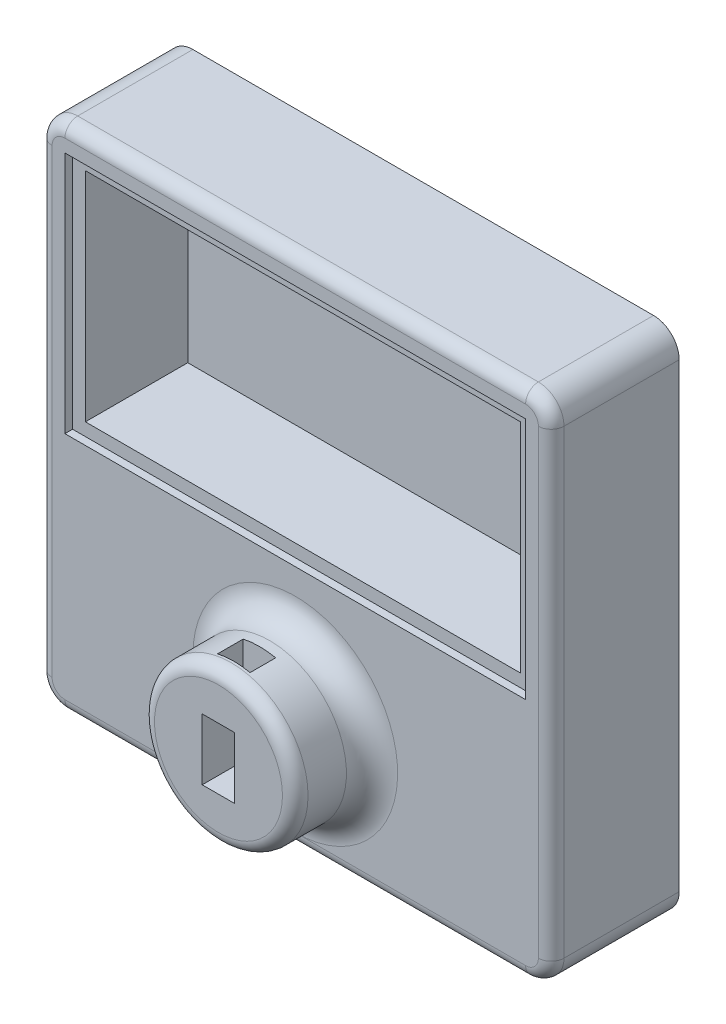
ISO-10303-21;
HEADER;
FILE_DESCRIPTION(('STEP AP214'),'2;1');
FILE_NAME('part.step','',(''),(''),'','','');
FILE_SCHEMA(('AUTOMOTIVE_DESIGN { 1 0 10303 214 1 1 1 1 }'));
ENDSEC;
DATA;
#1=APPLICATION_CONTEXT('core data for automotive mechanical design processes');
#2=APPLICATION_PROTOCOL_DEFINITION('international standard','automotive_design',2000,#1);
#3=PRODUCT_CONTEXT('',#1,'mechanical');
#4=PRODUCT('Part','Part','',(#3));
#5=PRODUCT_RELATED_PRODUCT_CATEGORY('part','',(#4));
#6=PRODUCT_DEFINITION_FORMATION('','',#4);
#7=PRODUCT_DEFINITION_CONTEXT('part definition',#1,'design');
#8=PRODUCT_DEFINITION('design','',#6,#7);
#9=PRODUCT_DEFINITION_SHAPE('','',#8);
#10=(LENGTH_UNIT() NAMED_UNIT(*) SI_UNIT(.MILLI.,.METRE.));
#11=(NAMED_UNIT(*) PLANE_ANGLE_UNIT() SI_UNIT($,.RADIAN.));
#12=(NAMED_UNIT(*) SI_UNIT($,.STERADIAN.) SOLID_ANGLE_UNIT());
#13=UNCERTAINTY_MEASURE_WITH_UNIT(LENGTH_MEASURE(1.E-05),#10,'distance_accuracy_value','');
#14=(GEOMETRIC_REPRESENTATION_CONTEXT(3) GLOBAL_UNCERTAINTY_ASSIGNED_CONTEXT((#13)) GLOBAL_UNIT_ASSIGNED_CONTEXT((#10,
#11,#12)) REPRESENTATION_CONTEXT('',''));
#15=CARTESIAN_POINT('',(0.,0.,0.));
#16=DIRECTION('',(0.,0.,1.));
#17=DIRECTION('',(1.,0.,0.));
#18=AXIS2_PLACEMENT_3D('',#15,#16,#17);
#19=CARTESIAN_POINT('',(0.,0.,50.));
#20=DIRECTION('',(1.,0.,0.));
#21=DIRECTION('',(0.,0.,-1.));
#22=AXIS2_PLACEMENT_3D('',#19,#20,#21);
#23=PLANE('',#22);
#24=DIRECTION('',(0.,0.,-1.));
#25=VECTOR('',#24,1.);
#26=CARTESIAN_POINT('',(0.,10.,50.));
#27=LINE('',#26,#25);
#28=CARTESIAN_POINT('',(0.,10.,0.));
#29=VERTEX_POINT('',#28);
#30=CARTESIAN_POINT('',(0.,10.,45.));
#31=VERTEX_POINT('',#30);
#32=EDGE_CURVE('E346',#29,#31,#27,.F.);
#33=ORIENTED_EDGE('',*,*,#32,.T.);
#34=DIRECTION('',(0.,-1.,0.));
#35=VECTOR('',#34,1.);
#36=CARTESIAN_POINT('',(0.,0.,45.));
#37=LINE('',#36,#35);
#38=CARTESIAN_POINT('',(0.,190.,45.));
#39=VERTEX_POINT('',#38);
#40=EDGE_CURVE('E385',#31,#39,#37,.F.);
#41=ORIENTED_EDGE('',*,*,#40,.T.);
#42=DIRECTION('',(0.,0.,-1.));
#43=VECTOR('',#42,1.);
#44=CARTESIAN_POINT('',(0.,190.,50.));
#45=LINE('',#44,#43);
#46=CARTESIAN_POINT('',(0.,190.,0.));
#47=VERTEX_POINT('',#46);
#48=EDGE_CURVE('E349',#39,#47,#45,.T.);
#49=ORIENTED_EDGE('',*,*,#48,.T.);
#50=DIRECTION('',(0.,-1.,0.));
#51=VECTOR('',#50,1.);
#52=CARTESIAN_POINT('',(0.,0.,0.));
#53=LINE('',#52,#51);
#54=EDGE_CURVE('E305',#47,#29,#53,.T.);
#55=ORIENTED_EDGE('',*,*,#54,.T.);
#56=EDGE_LOOP('',(#33,#41,#49,#55));
#57=FACE_BOUND('',#56,.T.);
#58=ADVANCED_FACE('F36',(#57),#23,.F.);
#59=CARTESIAN_POINT('',(0.,0.,50.));
#60=DIRECTION('',(0.,1.,0.));
#61=DIRECTION('',(0.,0.,1.));
#62=AXIS2_PLACEMENT_3D('',#59,#60,#61);
#63=PLANE('',#62);
#64=DIRECTION('',(0.,0.,-1.));
#65=VECTOR('',#64,1.);
#66=CARTESIAN_POINT('',(190.,0.,50.));
#67=LINE('',#66,#65);
#68=CARTESIAN_POINT('',(190.,0.,0.));
#69=VERTEX_POINT('',#68);
#70=CARTESIAN_POINT('',(190.,0.,45.));
#71=VERTEX_POINT('',#70);
#72=EDGE_CURVE('E338',#69,#71,#67,.F.);
#73=ORIENTED_EDGE('',*,*,#72,.T.);
#74=DIRECTION('',(1.,0.,0.));
#75=VECTOR('',#74,1.);
#76=CARTESIAN_POINT('',(0.,0.,45.));
#77=LINE('',#76,#75);
#78=CARTESIAN_POINT('',(10.,0.,45.));
#79=VERTEX_POINT('',#78);
#80=EDGE_CURVE('E11',#71,#79,#77,.F.);
#81=ORIENTED_EDGE('',*,*,#80,.T.);
#82=DIRECTION('',(0.,0.,-1.));
#83=VECTOR('',#82,1.);
#84=CARTESIAN_POINT('',(10.,0.,50.));
#85=LINE('',#84,#83);
#86=CARTESIAN_POINT('',(10.,0.,0.));
#87=VERTEX_POINT('',#86);
#88=EDGE_CURVE('E336',#79,#87,#85,.T.);
#89=ORIENTED_EDGE('',*,*,#88,.T.);
#90=DIRECTION('',(1.,0.,0.));
#91=VECTOR('',#90,1.);
#92=CARTESIAN_POINT('',(0.,0.,0.));
#93=LINE('',#92,#91);
#94=EDGE_CURVE('E314',#87,#69,#93,.T.);
#95=ORIENTED_EDGE('',*,*,#94,.T.);
#96=EDGE_LOOP('',(#73,#81,#89,#95));
#97=FACE_BOUND('',#96,.T.);
#98=ADVANCED_FACE('F474',(#97),#63,.F.);
#99=CARTESIAN_POINT('',(200.,0.,50.));
#100=DIRECTION('',(-1.,0.,0.));
#101=DIRECTION('',(0.,0.,1.));
#102=AXIS2_PLACEMENT_3D('',#99,#100,#101);
#103=PLANE('',#102);
#104=DIRECTION('',(0.,0.,-1.));
#105=VECTOR('',#104,1.);
#106=CARTESIAN_POINT('',(200.,190.,50.));
#107=LINE('',#106,#105);
#108=CARTESIAN_POINT('',(200.,190.,0.));
#109=VERTEX_POINT('',#108);
#110=CARTESIAN_POINT('',(200.,190.,45.));
#111=VERTEX_POINT('',#110);
#112=EDGE_CURVE('E323',#109,#111,#107,.F.);
#113=ORIENTED_EDGE('',*,*,#112,.T.);
#114=DIRECTION('',(0.,1.,0.));
#115=VECTOR('',#114,1.);
#116=CARTESIAN_POINT('',(200.,0.,45.));
#117=LINE('',#116,#115);
#118=CARTESIAN_POINT('',(200.,10.,45.));
#119=VERTEX_POINT('',#118);
#120=EDGE_CURVE('E393',#111,#119,#117,.F.);
#121=ORIENTED_EDGE('',*,*,#120,.T.);
#122=DIRECTION('',(0.,0.,-1.));
#123=VECTOR('',#122,1.);
#124=CARTESIAN_POINT('',(200.,10.,50.));
#125=LINE('',#124,#123);
#126=CARTESIAN_POINT('',(200.,10.,0.));
#127=VERTEX_POINT('',#126);
#128=EDGE_CURVE('E326',#119,#127,#125,.T.);
#129=ORIENTED_EDGE('',*,*,#128,.T.);
#130=DIRECTION('',(0.,1.,0.));
#131=VECTOR('',#130,1.);
#132=CARTESIAN_POINT('',(200.,0.,0.));
#133=LINE('',#132,#131);
#134=EDGE_CURVE('E317',#127,#109,#133,.T.);
#135=ORIENTED_EDGE('',*,*,#134,.T.);
#136=EDGE_LOOP('',(#113,#121,#129,#135));
#137=FACE_BOUND('',#136,.T.);
#138=ADVANCED_FACE('F433',(#137),#103,.F.);
#139=CARTESIAN_POINT('',(0.,200.,50.));
#140=DIRECTION('',(0.,-1.,0.));
#141=DIRECTION('',(0.,0.,-1.));
#142=AXIS2_PLACEMENT_3D('',#139,#140,#141);
#143=PLANE('',#142);
#144=DIRECTION('',(0.,0.,-1.));
#145=VECTOR('',#144,1.);
#146=CARTESIAN_POINT('',(10.,200.,50.));
#147=LINE('',#146,#145);
#148=CARTESIAN_POINT('',(10.,200.,0.));
#149=VERTEX_POINT('',#148);
#150=CARTESIAN_POINT('',(10.,200.,45.));
#151=VERTEX_POINT('',#150);
#152=EDGE_CURVE('E341',#149,#151,#147,.F.);
#153=ORIENTED_EDGE('',*,*,#152,.T.);
#154=DIRECTION('',(-1.,0.,0.));
#155=VECTOR('',#154,1.);
#156=CARTESIAN_POINT('',(0.,200.,45.));
#157=LINE('',#156,#155);
#158=CARTESIAN_POINT('',(190.,200.,45.));
#159=VERTEX_POINT('',#158);
#160=EDGE_CURVE('E389',#151,#159,#157,.F.);
#161=ORIENTED_EDGE('',*,*,#160,.T.);
#162=DIRECTION('',(0.,0.,-1.));
#163=VECTOR('',#162,1.);
#164=CARTESIAN_POINT('',(190.,200.,50.));
#165=LINE('',#164,#163);
#166=CARTESIAN_POINT('',(190.,200.,0.));
#167=VERTEX_POINT('',#166);
#168=EDGE_CURVE('E344',#159,#167,#165,.T.);
#169=ORIENTED_EDGE('',*,*,#168,.T.);
#170=DIRECTION('',(-1.,0.,0.));
#171=VECTOR('',#170,1.);
#172=CARTESIAN_POINT('',(0.,200.,0.));
#173=LINE('',#172,#171);
#174=EDGE_CURVE('E320',#167,#149,#173,.T.);
#175=ORIENTED_EDGE('',*,*,#174,.T.);
#176=EDGE_LOOP('',(#153,#161,#169,#175));
#177=FACE_BOUND('',#176,.T.);
#178=ADVANCED_FACE('F445',(#177),#143,.F.);
#179=CARTESIAN_POINT('',(0.,0.,50.));
#180=DIRECTION('',(0.,0.,-1.));
#181=DIRECTION('',(-1.,0.,0.));
#182=AXIS2_PLACEMENT_3D('',#179,#180,#181);
#183=PLANE('',#182);
#184=DIRECTION('',(1.,0.,0.));
#185=VECTOR('',#184,1.);
#186=CARTESIAN_POINT('',(10.,95.,50.));
#187=LINE('',#186,#185);
#188=CARTESIAN_POINT('',(10.,95.,50.));
#189=VERTEX_POINT('',#188);
#190=CARTESIAN_POINT('',(190.,95.,50.));
#191=VERTEX_POINT('',#190);
#192=EDGE_CURVE('E295',#189,#191,#187,.T.);
#193=ORIENTED_EDGE('',*,*,#192,.F.);
#194=DIRECTION('',(0.,-1.,0.));
#195=VECTOR('',#194,1.);
#196=CARTESIAN_POINT('',(10.,190.,50.));
#197=LINE('',#196,#195);
#198=CARTESIAN_POINT('',(10.,190.,50.));
#199=VERTEX_POINT('',#198);
#200=EDGE_CURVE('E273',#199,#189,#197,.T.);
#201=ORIENTED_EDGE('',*,*,#200,.F.);
#202=DIRECTION('',(-1.,0.,0.));
#203=VECTOR('',#202,1.);
#204=CARTESIAN_POINT('',(10.,190.,50.));
#205=LINE('',#204,#203);
#206=CARTESIAN_POINT('',(190.,190.,50.));
#207=VERTEX_POINT('',#206);
#208=EDGE_CURVE('E284',#207,#199,#205,.T.);
#209=ORIENTED_EDGE('',*,*,#208,.F.);
#210=DIRECTION('',(0.,1.,0.));
#211=VECTOR('',#210,1.);
#212=CARTESIAN_POINT('',(190.,190.,50.));
#213=LINE('',#212,#211);
#214=EDGE_CURVE('E298',#191,#207,#213,.T.);
#215=ORIENTED_EDGE('',*,*,#214,.F.);
#216=EDGE_LOOP('',(#193,#201,#209,#215));
#217=FACE_BOUND('',#216,.T.);
#218=DIRECTION('',(0.,-1.,0.));
#219=VECTOR('',#218,1.);
#220=CARTESIAN_POINT('',(5.,0.,50.));
#221=LINE('',#220,#219);
#222=CARTESIAN_POINT('',(5.,190.,50.));
#223=VERTEX_POINT('',#222);
#224=CARTESIAN_POINT('',(5.,10.,50.));
#225=VERTEX_POINT('',#224);
#226=EDGE_CURVE('E377',#223,#225,#221,.T.);
#227=ORIENTED_EDGE('',*,*,#226,.T.);
#228=CARTESIAN_POINT('',(10.,10.,50.));
#229=DIRECTION('',(0.,0.,-1.));
#230=DIRECTION('',(-1.,0.,0.));
#231=AXIS2_PLACEMENT_3D('',#228,#229,#230);
#232=CIRCLE('',#231,5.);
#233=CARTESIAN_POINT('',(10.,5.,50.));
#234=VERTEX_POINT('',#233);
#235=EDGE_CURVE('E379',#225,#234,#232,.F.);
#236=ORIENTED_EDGE('',*,*,#235,.T.);
#237=DIRECTION('',(1.,0.,0.));
#238=VECTOR('',#237,1.);
#239=CARTESIAN_POINT('',(0.,5.,50.));
#240=LINE('',#239,#238);
#241=CARTESIAN_POINT('',(100.,5.,50.));
#242=VERTEX_POINT('',#241);
#243=EDGE_CURVE('E365',#234,#242,#240,.T.);
#244=ORIENTED_EDGE('',*,*,#243,.T.);
#245=CARTESIAN_POINT('',(100.,45.,50.));
#246=DIRECTION('',(0.,0.,-1.));
#247=DIRECTION('',(-1.,0.,0.));
#248=AXIS2_PLACEMENT_3D('',#245,#246,#247);
#249=CIRCLE('',#248,40.);
#250=EDGE_CURVE('E354',#242,#242,#249,.T.);
#251=ORIENTED_EDGE('',*,*,#250,.T.);
#252=DIRECTION('',(1.,0.,0.));
#253=VECTOR('',#252,1.);
#254=CARTESIAN_POINT('',(0.,5.,50.));
#255=LINE('',#254,#253);
#256=CARTESIAN_POINT('',(190.,5.,50.));
#257=VERTEX_POINT('',#256);
#258=EDGE_CURVE('E363',#242,#257,#255,.T.);
#259=ORIENTED_EDGE('',*,*,#258,.T.);
#260=CARTESIAN_POINT('',(190.,10.,50.));
#261=DIRECTION('',(0.,0.,-1.));
#262=DIRECTION('',(-1.,0.,0.));
#263=AXIS2_PLACEMENT_3D('',#260,#261,#262);
#264=CIRCLE('',#263,5.);
#265=CARTESIAN_POINT('',(195.,10.,50.));
#266=VERTEX_POINT('',#265);
#267=EDGE_CURVE('E367',#257,#266,#264,.F.);
#268=ORIENTED_EDGE('',*,*,#267,.T.);
#269=DIRECTION('',(0.,1.,0.));
#270=VECTOR('',#269,1.);
#271=CARTESIAN_POINT('',(195.,0.,50.));
#272=LINE('',#271,#270);
#273=CARTESIAN_POINT('',(195.,190.,50.));
#274=VERTEX_POINT('',#273);
#275=EDGE_CURVE('E369',#266,#274,#272,.T.);
#276=ORIENTED_EDGE('',*,*,#275,.T.);
#277=CARTESIAN_POINT('',(190.,190.,50.));
#278=DIRECTION('',(0.,0.,-1.));
#279=DIRECTION('',(-1.,0.,0.));
#280=AXIS2_PLACEMENT_3D('',#277,#278,#279);
#281=CIRCLE('',#280,5.);
#282=CARTESIAN_POINT('',(190.,195.,50.));
#283=VERTEX_POINT('',#282);
#284=EDGE_CURVE('E371',#274,#283,#281,.F.);
#285=ORIENTED_EDGE('',*,*,#284,.T.);
#286=DIRECTION('',(-1.,0.,0.));
#287=VECTOR('',#286,1.);
#288=CARTESIAN_POINT('',(0.,195.,50.));
#289=LINE('',#288,#287);
#290=CARTESIAN_POINT('',(10.,195.,50.));
#291=VERTEX_POINT('',#290);
#292=EDGE_CURVE('E373',#283,#291,#289,.T.);
#293=ORIENTED_EDGE('',*,*,#292,.T.);
#294=CARTESIAN_POINT('',(10.,190.,50.));
#295=DIRECTION('',(0.,0.,-1.));
#296=DIRECTION('',(-1.,0.,0.));
#297=AXIS2_PLACEMENT_3D('',#294,#295,#296);
#298=CIRCLE('',#297,5.);
#299=EDGE_CURVE('E375',#291,#223,#298,.F.);
#300=ORIENTED_EDGE('',*,*,#299,.T.);
#301=EDGE_LOOP('',(#227,#236,#244,#251,#259,#268,#276,#285,#293,#300));
#302=FACE_BOUND('',#301,.T.);
#303=ADVANCED_FACE('F461',(#217,#302),#183,.F.);
#304=CARTESIAN_POINT('',(0.,0.,0.));
#305=DIRECTION('',(0.,0.,-1.));
#306=DIRECTION('',(-1.,0.,0.));
#307=AXIS2_PLACEMENT_3D('',#304,#305,#306);
#308=PLANE('',#307);
#309=ORIENTED_EDGE('',*,*,#134,.F.);
#310=CARTESIAN_POINT('',(190.,10.,0.));
#311=DIRECTION('',(0.,0.,-1.));
#312=DIRECTION('',(-1.,0.,0.));
#313=AXIS2_PLACEMENT_3D('',#310,#311,#312);
#314=CIRCLE('',#313,10.);
#315=EDGE_CURVE('E334',#127,#69,#314,.T.);
#316=ORIENTED_EDGE('',*,*,#315,.T.);
#317=ORIENTED_EDGE('',*,*,#94,.F.);
#318=CARTESIAN_POINT('',(10.,10.,0.));
#319=DIRECTION('',(0.,0.,-1.));
#320=DIRECTION('',(-1.,0.,0.));
#321=AXIS2_PLACEMENT_3D('',#318,#319,#320);
#322=CIRCLE('',#321,10.);
#323=EDGE_CURVE('E328',#87,#29,#322,.T.);
#324=ORIENTED_EDGE('',*,*,#323,.T.);
#325=ORIENTED_EDGE('',*,*,#54,.F.);
#326=CARTESIAN_POINT('',(10.,190.,0.));
#327=DIRECTION('',(0.,0.,-1.));
#328=DIRECTION('',(-1.,0.,0.));
#329=AXIS2_PLACEMENT_3D('',#326,#327,#328);
#330=CIRCLE('',#329,10.);
#331=EDGE_CURVE('E330',#47,#149,#330,.T.);
#332=ORIENTED_EDGE('',*,*,#331,.T.);
#333=ORIENTED_EDGE('',*,*,#174,.F.);
#334=CARTESIAN_POINT('',(190.,190.,0.));
#335=DIRECTION('',(0.,0.,-1.));
#336=DIRECTION('',(-1.,0.,0.));
#337=AXIS2_PLACEMENT_3D('',#334,#335,#336);
#338=CIRCLE('',#337,10.);
#339=EDGE_CURVE('E332',#167,#109,#338,.T.);
#340=ORIENTED_EDGE('',*,*,#339,.T.);
#341=EDGE_LOOP('',(#309,#316,#317,#324,#325,#332,#333,#340));
#342=FACE_BOUND('',#341,.T.);
#343=ADVANCED_FACE('F438',(#342),#308,.T.);
#344=CARTESIAN_POINT('',(190.,10.,50.));
#345=DIRECTION('',(0.,0.,-1.));
#346=DIRECTION('',(-1.,0.,0.));
#347=AXIS2_PLACEMENT_3D('',#344,#345,#346);
#348=CYLINDRICAL_SURFACE('',#347,10.);
#349=ORIENTED_EDGE('',*,*,#128,.F.);
#350=CARTESIAN_POINT('',(190.,10.,45.));
#351=DIRECTION('',(0.,0.,-1.));
#352=DIRECTION('',(-1.,0.,0.));
#353=AXIS2_PLACEMENT_3D('',#350,#351,#352);
#354=CIRCLE('',#353,10.);
#355=EDGE_CURVE('E45',#119,#71,#354,.T.);
#356=ORIENTED_EDGE('',*,*,#355,.T.);
#357=ORIENTED_EDGE('',*,*,#72,.F.);
#358=ORIENTED_EDGE('',*,*,#315,.F.);
#359=EDGE_LOOP('',(#349,#356,#357,#358));
#360=FACE_BOUND('',#359,.T.);
#361=ADVANCED_FACE('F472',(#360),#348,.T.);
#362=CARTESIAN_POINT('',(190.,190.,50.));
#363=DIRECTION('',(0.,0.,-1.));
#364=DIRECTION('',(-1.,0.,0.));
#365=AXIS2_PLACEMENT_3D('',#362,#363,#364);
#366=CYLINDRICAL_SURFACE('',#365,10.);
#367=ORIENTED_EDGE('',*,*,#168,.F.);
#368=CARTESIAN_POINT('',(190.,190.,45.));
#369=DIRECTION('',(0.,0.,-1.));
#370=DIRECTION('',(-1.,0.,0.));
#371=AXIS2_PLACEMENT_3D('',#368,#369,#370);
#372=CIRCLE('',#371,10.);
#373=EDGE_CURVE('E391',#159,#111,#372,.T.);
#374=ORIENTED_EDGE('',*,*,#373,.T.);
#375=ORIENTED_EDGE('',*,*,#112,.F.);
#376=ORIENTED_EDGE('',*,*,#339,.F.);
#377=EDGE_LOOP('',(#367,#374,#375,#376));
#378=FACE_BOUND('',#377,.T.);
#379=ADVANCED_FACE('F430',(#378),#366,.T.);
#380=CARTESIAN_POINT('',(10.,190.,50.));
#381=DIRECTION('',(0.,0.,-1.));
#382=DIRECTION('',(-1.,0.,0.));
#383=AXIS2_PLACEMENT_3D('',#380,#381,#382);
#384=CYLINDRICAL_SURFACE('',#383,10.);
#385=ORIENTED_EDGE('',*,*,#48,.F.);
#386=CARTESIAN_POINT('',(10.,190.,45.));
#387=DIRECTION('',(0.,0.,-1.));
#388=DIRECTION('',(-1.,0.,0.));
#389=AXIS2_PLACEMENT_3D('',#386,#387,#388);
#390=CIRCLE('',#389,10.);
#391=EDGE_CURVE('E387',#39,#151,#390,.T.);
#392=ORIENTED_EDGE('',*,*,#391,.T.);
#393=ORIENTED_EDGE('',*,*,#152,.F.);
#394=ORIENTED_EDGE('',*,*,#331,.F.);
#395=EDGE_LOOP('',(#385,#392,#393,#394));
#396=FACE_BOUND('',#395,.T.);
#397=ADVANCED_FACE('F448',(#396),#384,.T.);
#398=CARTESIAN_POINT('',(10.,10.,50.));
#399=DIRECTION('',(0.,0.,-1.));
#400=DIRECTION('',(-1.,0.,0.));
#401=AXIS2_PLACEMENT_3D('',#398,#399,#400);
#402=CYLINDRICAL_SURFACE('',#401,10.);
#403=ORIENTED_EDGE('',*,*,#88,.F.);
#404=CARTESIAN_POINT('',(10.,10.,45.));
#405=DIRECTION('',(0.,0.,-1.));
#406=DIRECTION('',(-1.,0.,0.));
#407=AXIS2_PLACEMENT_3D('',#404,#405,#406);
#408=CIRCLE('',#407,10.);
#409=EDGE_CURVE('E382',#79,#31,#408,.T.);
#410=ORIENTED_EDGE('',*,*,#409,.T.);
#411=ORIENTED_EDGE('',*,*,#32,.F.);
#412=ORIENTED_EDGE('',*,*,#323,.F.);
#413=EDGE_LOOP('',(#403,#410,#411,#412));
#414=FACE_BOUND('',#413,.T.);
#415=ADVANCED_FACE('F480',(#414),#402,.T.);
#416=CARTESIAN_POINT('',(100.,45.,80.));
#417=DIRECTION('',(0.,0.,-1.));
#418=DIRECTION('',(-1.,0.,0.));
#419=AXIS2_PLACEMENT_3D('',#416,#417,#418);
#420=CYLINDRICAL_SURFACE('',#419,30.);
#421=CARTESIAN_POINT('',(100.,45.,74.));
#422=DIRECTION('',(0.,0.,1.));
#423=DIRECTION('',(1.,0.,0.));
#424=AXIS2_PLACEMENT_3D('',#421,#422,#423);
#425=CIRCLE('',#424,30.);
#426=CARTESIAN_POINT('',(106.35,74.3202575022799,74.));
#427=VERTEX_POINT('',#426);
#428=CARTESIAN_POINT('',(93.65,74.3202575022799,74.));
#429=VERTEX_POINT('',#428);
#430=EDGE_CURVE('E222',#427,#429,#425,.T.);
#431=ORIENTED_EDGE('',*,*,#430,.T.);
#432=DIRECTION('',(0.,0.,-1.));
#433=VECTOR('',#432,1.);
#434=CARTESIAN_POINT('',(93.65,74.3202575022799,80.));
#435=LINE('',#434,#433);
#436=CARTESIAN_POINT('',(93.65,74.3202575022799,64.));
#437=VERTEX_POINT('',#436);
#438=EDGE_CURVE('E808',#429,#437,#435,.T.);
#439=ORIENTED_EDGE('',*,*,#438,.T.);
#440=CARTESIAN_POINT('',(100.,45.,64.));
#441=DIRECTION('',(0.,0.,-1.));
#442=DIRECTION('',(-1.,0.,0.));
#443=AXIS2_PLACEMENT_3D('',#440,#441,#442);
#444=CIRCLE('',#443,30.);
#445=CARTESIAN_POINT('',(106.35,74.3202575022799,64.));
#446=VERTEX_POINT('',#445);
#447=EDGE_CURVE('E819',#437,#446,#444,.T.);
#448=ORIENTED_EDGE('',*,*,#447,.T.);
#449=DIRECTION('',(0.,0.,-1.));
#450=VECTOR('',#449,1.);
#451=CARTESIAN_POINT('',(106.35,74.3202575022799,80.));
#452=LINE('',#451,#450);
#453=EDGE_CURVE('E822',#446,#427,#452,.F.);
#454=ORIENTED_EDGE('',*,*,#453,.T.);
#455=EDGE_LOOP('',(#431,#439,#448,#454));
#456=FACE_BOUND('',#455,.T.);
#457=CARTESIAN_POINT('',(100.,45.,75.));
#458=DIRECTION('',(0.,0.,1.));
#459=DIRECTION('',(1.,0.,0.));
#460=AXIS2_PLACEMENT_3D('',#457,#458,#459);
#461=CIRCLE('',#460,30.);
#462=CARTESIAN_POINT('',(130.,45.,75.));
#463=VERTEX_POINT('',#462);
#464=EDGE_CURVE('E360',#463,#463,#461,.F.);
#465=ORIENTED_EDGE('',*,*,#464,.T.);
#466=EDGE_LOOP('',(#465));
#467=FACE_BOUND('',#466,.T.);
#468=CARTESIAN_POINT('',(100.,45.,60.));
#469=DIRECTION('',(0.,0.,-1.));
#470=DIRECTION('',(-1.,0.,0.));
#471=AXIS2_PLACEMENT_3D('',#468,#469,#470);
#472=CIRCLE('',#471,30.);
#473=CARTESIAN_POINT('',(70.,45.,60.));
#474=VERTEX_POINT('',#473);
#475=EDGE_CURVE('E351',#474,#474,#472,.F.);
#476=ORIENTED_EDGE('',*,*,#475,.T.);
#477=EDGE_LOOP('',(#476));
#478=FACE_BOUND('',#477,.T.);
#479=ADVANCED_FACE('F499',(#456,#467,#478),#420,.T.);
#480=CARTESIAN_POINT('',(100.,45.,80.));
#481=DIRECTION('',(0.,0.,1.));
#482=DIRECTION('',(1.,0.,0.));
#483=AXIS2_PLACEMENT_3D('',#480,#481,#482);
#484=PLANE('',#483);
#485=DIRECTION('',(1.,0.,0.));
#486=VECTOR('',#485,1.);
#487=CARTESIAN_POINT('',(0.,33.,80.));
#488=LINE('',#487,#486);
#489=CARTESIAN_POINT('',(93.65,33.,80.));
#490=VERTEX_POINT('',#489);
#491=CARTESIAN_POINT('',(106.35,33.,80.));
#492=VERTEX_POINT('',#491);
#493=EDGE_CURVE('E61',#490,#492,#488,.T.);
#494=ORIENTED_EDGE('',*,*,#493,.F.);
#495=DIRECTION('',(0.,-1.,0.));
#496=VECTOR('',#495,1.);
#497=CARTESIAN_POINT('',(93.65,0.,80.));
#498=LINE('',#497,#496);
#499=CARTESIAN_POINT('',(93.65,57.,80.));
#500=VERTEX_POINT('',#499);
#501=EDGE_CURVE('E801',#500,#490,#498,.T.);
#502=ORIENTED_EDGE('',*,*,#501,.F.);
#503=DIRECTION('',(1.,0.,0.));
#504=VECTOR('',#503,1.);
#505=CARTESIAN_POINT('',(0.,57.,80.));
#506=LINE('',#505,#504);
#507=CARTESIAN_POINT('',(106.35,57.,80.));
#508=VERTEX_POINT('',#507);
#509=EDGE_CURVE('E805',#500,#508,#506,.T.);
#510=ORIENTED_EDGE('',*,*,#509,.T.);
#511=DIRECTION('',(0.,-1.,0.));
#512=VECTOR('',#511,1.);
#513=CARTESIAN_POINT('',(106.35,0.,80.));
#514=LINE('',#513,#512);
#515=EDGE_CURVE('E237',#508,#492,#514,.T.);
#516=ORIENTED_EDGE('',*,*,#515,.T.);
#517=EDGE_LOOP('',(#494,#502,#510,#516));
#518=FACE_BOUND('',#517,.T.);
#519=CARTESIAN_POINT('',(100.,45.,80.));
#520=DIRECTION('',(0.,0.,1.));
#521=DIRECTION('',(1.,0.,0.));
#522=AXIS2_PLACEMENT_3D('',#519,#520,#521);
#523=CIRCLE('',#522,25.);
#524=CARTESIAN_POINT('',(125.,45.,80.));
#525=VERTEX_POINT('',#524);
#526=EDGE_CURVE('E357',#525,#525,#523,.T.);
#527=ORIENTED_EDGE('',*,*,#526,.T.);
#528=EDGE_LOOP('',(#527));
#529=FACE_BOUND('',#528,.T.);
#530=ADVANCED_FACE('F495',(#518,#529),#484,.T.);
#531=CARTESIAN_POINT('',(100.,45.,60.));
#532=DIRECTION('',(0.,0.,-1.));
#533=DIRECTION('',(-1.,0.,0.));
#534=AXIS2_PLACEMENT_3D('',#531,#532,#533);
#535=TOROIDAL_SURFACE('',#534,40.,10.);
#536=ORIENTED_EDGE('',*,*,#250,.F.);
#537=EDGE_LOOP('',(#536));
#538=FACE_BOUND('',#537,.T.);
#539=ORIENTED_EDGE('',*,*,#475,.F.);
#540=EDGE_LOOP('',(#539));
#541=FACE_BOUND('',#540,.T.);
#542=ADVANCED_FACE('F491',(#538,#541),#535,.F.);
#543=CARTESIAN_POINT('',(100.,45.,75.));
#544=DIRECTION('',(0.,0.,1.));
#545=DIRECTION('',(1.,0.,0.));
#546=AXIS2_PLACEMENT_3D('',#543,#544,#545);
#547=TOROIDAL_SURFACE('',#546,25.,5.);
#548=ORIENTED_EDGE('',*,*,#464,.F.);
#549=EDGE_LOOP('',(#548));
#550=FACE_BOUND('',#549,.T.);
#551=ORIENTED_EDGE('',*,*,#526,.F.);
#552=EDGE_LOOP('',(#551));
#553=FACE_BOUND('',#552,.T.);
#554=ADVANCED_FACE('F494',(#550,#553),#547,.T.);
#555=CARTESIAN_POINT('',(10.,190.,47.));
#556=DIRECTION('',(-1.,0.,0.));
#557=DIRECTION('',(0.,-1.,0.));
#558=AXIS2_PLACEMENT_3D('',#555,#556,#557);
#559=PLANE('',#558);
#560=ORIENTED_EDGE('',*,*,#200,.T.);
#561=DIRECTION('',(0.,0.,1.));
#562=VECTOR('',#561,1.);
#563=CARTESIAN_POINT('',(10.,95.,47.));
#564=LINE('',#563,#562);
#565=CARTESIAN_POINT('',(10.,95.,47.));
#566=VERTEX_POINT('',#565);
#567=EDGE_CURVE('E293',#566,#189,#564,.T.);
#568=ORIENTED_EDGE('',*,*,#567,.F.);
#569=DIRECTION('',(0.,-1.,0.));
#570=VECTOR('',#569,1.);
#571=CARTESIAN_POINT('',(10.,190.,47.));
#572=LINE('',#571,#570);
#573=CARTESIAN_POINT('',(10.,190.,47.));
#574=VERTEX_POINT('',#573);
#575=EDGE_CURVE('E280',#574,#566,#572,.T.);
#576=ORIENTED_EDGE('',*,*,#575,.F.);
#577=DIRECTION('',(0.,0.,1.));
#578=VECTOR('',#577,1.);
#579=CARTESIAN_POINT('',(10.,190.,47.));
#580=LINE('',#579,#578);
#581=EDGE_CURVE('E303',#574,#199,#580,.T.);
#582=ORIENTED_EDGE('',*,*,#581,.T.);
#583=EDGE_LOOP('',(#560,#568,#576,#582));
#584=FACE_BOUND('',#583,.T.);
#585=ADVANCED_FACE('F528',(#584),#559,.F.);
#586=CARTESIAN_POINT('',(10.,190.,47.));
#587=DIRECTION('',(0.,1.,0.));
#588=DIRECTION('',(0.,0.,1.));
#589=AXIS2_PLACEMENT_3D('',#586,#587,#588);
#590=PLANE('',#589);
#591=ORIENTED_EDGE('',*,*,#208,.T.);
#592=ORIENTED_EDGE('',*,*,#581,.F.);
#593=DIRECTION('',(-1.,0.,0.));
#594=VECTOR('',#593,1.);
#595=CARTESIAN_POINT('',(10.,190.,47.));
#596=LINE('',#595,#594);
#597=CARTESIAN_POINT('',(190.,190.,47.));
#598=VERTEX_POINT('',#597);
#599=EDGE_CURVE('E290',#598,#574,#596,.T.);
#600=ORIENTED_EDGE('',*,*,#599,.F.);
#601=DIRECTION('',(0.,0.,1.));
#602=VECTOR('',#601,1.);
#603=CARTESIAN_POINT('',(190.,190.,47.));
#604=LINE('',#603,#602);
#605=EDGE_CURVE('E306',#598,#207,#604,.T.);
#606=ORIENTED_EDGE('',*,*,#605,.T.);
#607=EDGE_LOOP('',(#591,#592,#600,#606));
#608=FACE_BOUND('',#607,.T.);
#609=ADVANCED_FACE('F578',(#608),#590,.F.);
#610=CARTESIAN_POINT('',(190.,190.,47.));
#611=DIRECTION('',(1.,0.,0.));
#612=DIRECTION('',(0.,0.,-1.));
#613=AXIS2_PLACEMENT_3D('',#610,#611,#612);
#614=PLANE('',#613);
#615=ORIENTED_EDGE('',*,*,#214,.T.);
#616=ORIENTED_EDGE('',*,*,#605,.F.);
#617=DIRECTION('',(0.,1.,0.));
#618=VECTOR('',#617,1.);
#619=CARTESIAN_POINT('',(190.,190.,47.));
#620=LINE('',#619,#618);
#621=CARTESIAN_POINT('',(190.,95.,47.));
#622=VERTEX_POINT('',#621);
#623=EDGE_CURVE('E287',#622,#598,#620,.T.);
#624=ORIENTED_EDGE('',*,*,#623,.F.);
#625=DIRECTION('',(0.,0.,1.));
#626=VECTOR('',#625,1.);
#627=CARTESIAN_POINT('',(190.,95.,47.));
#628=LINE('',#627,#626);
#629=EDGE_CURVE('E308',#622,#191,#628,.T.);
#630=ORIENTED_EDGE('',*,*,#629,.T.);
#631=EDGE_LOOP('',(#615,#616,#624,#630));
#632=FACE_BOUND('',#631,.T.);
#633=ADVANCED_FACE('F581',(#632),#614,.F.);
#634=CARTESIAN_POINT('',(10.,95.,47.));
#635=DIRECTION('',(0.,-1.,0.));
#636=DIRECTION('',(0.,0.,-1.));
#637=AXIS2_PLACEMENT_3D('',#634,#635,#636);
#638=PLANE('',#637);
#639=ORIENTED_EDGE('',*,*,#192,.T.);
#640=ORIENTED_EDGE('',*,*,#629,.F.);
#641=DIRECTION('',(1.,0.,0.));
#642=VECTOR('',#641,1.);
#643=CARTESIAN_POINT('',(10.,95.,47.));
#644=LINE('',#643,#642);
#645=EDGE_CURVE('E283',#566,#622,#644,.T.);
#646=ORIENTED_EDGE('',*,*,#645,.F.);
#647=ORIENTED_EDGE('',*,*,#567,.T.);
#648=EDGE_LOOP('',(#639,#640,#646,#647));
#649=FACE_BOUND('',#648,.T.);
#650=ADVANCED_FACE('F576',(#649),#638,.F.);
#651=CARTESIAN_POINT('',(0.,0.,47.));
#652=DIRECTION('',(0.,0.,1.));
#653=DIRECTION('',(1.,0.,0.));
#654=AXIS2_PLACEMENT_3D('',#651,#652,#653);
#655=PLANE('',#654);
#656=DIRECTION('',(0.,-1.,0.));
#657=VECTOR('',#656,1.);
#658=CARTESIAN_POINT('',(15.,185.,47.));
#659=LINE('',#658,#657);
#660=CARTESIAN_POINT('',(15.,185.,47.));
#661=VERTEX_POINT('',#660);
#662=CARTESIAN_POINT('',(15.,100.,47.));
#663=VERTEX_POINT('',#662);
#664=EDGE_CURVE('E261',#661,#663,#659,.T.);
#665=ORIENTED_EDGE('',*,*,#664,.F.);
#666=DIRECTION('',(-1.,0.,0.));
#667=VECTOR('',#666,1.);
#668=CARTESIAN_POINT('',(15.,185.,47.));
#669=LINE('',#668,#667);
#670=CARTESIAN_POINT('',(185.,185.,47.));
#671=VERTEX_POINT('',#670);
#672=EDGE_CURVE('E251',#671,#661,#669,.T.);
#673=ORIENTED_EDGE('',*,*,#672,.F.);
#674=DIRECTION('',(0.,1.,0.));
#675=VECTOR('',#674,1.);
#676=CARTESIAN_POINT('',(185.,185.,47.));
#677=LINE('',#676,#675);
#678=CARTESIAN_POINT('',(185.,100.,47.));
#679=VERTEX_POINT('',#678);
#680=EDGE_CURVE('E267',#679,#671,#677,.T.);
#681=ORIENTED_EDGE('',*,*,#680,.F.);
#682=DIRECTION('',(1.,0.,0.));
#683=VECTOR('',#682,1.);
#684=CARTESIAN_POINT('',(15.,100.,47.));
#685=LINE('',#684,#683);
#686=EDGE_CURVE('E264',#663,#679,#685,.T.);
#687=ORIENTED_EDGE('',*,*,#686,.F.);
#688=EDGE_LOOP('',(#665,#673,#681,#687));
#689=FACE_BOUND('',#688,.T.);
#690=ORIENTED_EDGE('',*,*,#575,.T.);
#691=ORIENTED_EDGE('',*,*,#645,.T.);
#692=ORIENTED_EDGE('',*,*,#623,.T.);
#693=ORIENTED_EDGE('',*,*,#599,.T.);
#694=EDGE_LOOP('',(#690,#691,#692,#693));
#695=FACE_BOUND('',#694,.T.);
#696=ADVANCED_FACE('F572',(#689,#695),#655,.T.);
#697=CARTESIAN_POINT('',(15.,185.,7.));
#698=DIRECTION('',(-1.,0.,0.));
#699=DIRECTION('',(0.,-1.,0.));
#700=AXIS2_PLACEMENT_3D('',#697,#698,#699);
#701=PLANE('',#700);
#702=ORIENTED_EDGE('',*,*,#664,.T.);
#703=DIRECTION('',(0.,0.,1.));
#704=VECTOR('',#703,1.);
#705=CARTESIAN_POINT('',(15.,100.,7.));
#706=LINE('',#705,#704);
#707=CARTESIAN_POINT('',(15.,100.,7.));
#708=VERTEX_POINT('',#707);
#709=EDGE_CURVE('E260',#708,#663,#706,.T.);
#710=ORIENTED_EDGE('',*,*,#709,.F.);
#711=DIRECTION('',(0.,-1.,0.));
#712=VECTOR('',#711,1.);
#713=CARTESIAN_POINT('',(15.,185.,7.));
#714=LINE('',#713,#712);
#715=CARTESIAN_POINT('',(15.,185.,7.));
#716=VERTEX_POINT('',#715);
#717=EDGE_CURVE('E247',#716,#708,#714,.T.);
#718=ORIENTED_EDGE('',*,*,#717,.F.);
#719=DIRECTION('',(0.,0.,1.));
#720=VECTOR('',#719,1.);
#721=CARTESIAN_POINT('',(15.,185.,7.));
#722=LINE('',#721,#720);
#723=EDGE_CURVE('E271',#716,#661,#722,.T.);
#724=ORIENTED_EDGE('',*,*,#723,.T.);
#725=EDGE_LOOP('',(#702,#710,#718,#724));
#726=FACE_BOUND('',#725,.T.);
#727=ADVANCED_FACE('F565',(#726),#701,.F.);
#728=CARTESIAN_POINT('',(15.,185.,7.));
#729=DIRECTION('',(0.,1.,0.));
#730=DIRECTION('',(0.,0.,1.));
#731=AXIS2_PLACEMENT_3D('',#728,#729,#730);
#732=PLANE('',#731);
#733=ORIENTED_EDGE('',*,*,#672,.T.);
#734=ORIENTED_EDGE('',*,*,#723,.F.);
#735=DIRECTION('',(-1.,0.,0.));
#736=VECTOR('',#735,1.);
#737=CARTESIAN_POINT('',(15.,185.,7.));
#738=LINE('',#737,#736);
#739=CARTESIAN_POINT('',(185.,185.,7.));
#740=VERTEX_POINT('',#739);
#741=EDGE_CURVE('E257',#740,#716,#738,.T.);
#742=ORIENTED_EDGE('',*,*,#741,.F.);
#743=DIRECTION('',(0.,0.,1.));
#744=VECTOR('',#743,1.);
#745=CARTESIAN_POINT('',(185.,185.,7.));
#746=LINE('',#745,#744);
#747=EDGE_CURVE('E274',#740,#671,#746,.T.);
#748=ORIENTED_EDGE('',*,*,#747,.T.);
#749=EDGE_LOOP('',(#733,#734,#742,#748));
#750=FACE_BOUND('',#749,.T.);
#751=ADVANCED_FACE('F562',(#750),#732,.F.);
#752=CARTESIAN_POINT('',(185.,185.,7.));
#753=DIRECTION('',(1.,0.,0.));
#754=DIRECTION('',(0.,0.,-1.));
#755=AXIS2_PLACEMENT_3D('',#752,#753,#754);
#756=PLANE('',#755);
#757=ORIENTED_EDGE('',*,*,#680,.T.);
#758=ORIENTED_EDGE('',*,*,#747,.F.);
#759=DIRECTION('',(0.,1.,0.));
#760=VECTOR('',#759,1.);
#761=CARTESIAN_POINT('',(185.,185.,7.));
#762=LINE('',#761,#760);
#763=CARTESIAN_POINT('',(185.,100.,7.));
#764=VERTEX_POINT('',#763);
#765=EDGE_CURVE('E254',#764,#740,#762,.T.);
#766=ORIENTED_EDGE('',*,*,#765,.F.);
#767=DIRECTION('',(0.,0.,1.));
#768=VECTOR('',#767,1.);
#769=CARTESIAN_POINT('',(185.,100.,7.));
#770=LINE('',#769,#768);
#771=EDGE_CURVE('E277',#764,#679,#770,.T.);
#772=ORIENTED_EDGE('',*,*,#771,.T.);
#773=EDGE_LOOP('',(#757,#758,#766,#772));
#774=FACE_BOUND('',#773,.T.);
#775=ADVANCED_FACE('F556',(#774),#756,.F.);
#776=CARTESIAN_POINT('',(15.,100.,7.));
#777=DIRECTION('',(0.,-1.,0.));
#778=DIRECTION('',(0.,0.,-1.));
#779=AXIS2_PLACEMENT_3D('',#776,#777,#778);
#780=PLANE('',#779);
#781=ORIENTED_EDGE('',*,*,#686,.T.);
#782=ORIENTED_EDGE('',*,*,#771,.F.);
#783=DIRECTION('',(1.,0.,0.));
#784=VECTOR('',#783,1.);
#785=CARTESIAN_POINT('',(15.,100.,7.));
#786=LINE('',#785,#784);
#787=EDGE_CURVE('E250',#708,#764,#786,.T.);
#788=ORIENTED_EDGE('',*,*,#787,.F.);
#789=ORIENTED_EDGE('',*,*,#709,.T.);
#790=EDGE_LOOP('',(#781,#782,#788,#789));
#791=FACE_BOUND('',#790,.T.);
#792=ADVANCED_FACE('F550',(#791),#780,.F.);
#793=CARTESIAN_POINT('',(0.,0.,7.));
#794=DIRECTION('',(0.,0.,1.));
#795=DIRECTION('',(1.,0.,0.));
#796=AXIS2_PLACEMENT_3D('',#793,#794,#795);
#797=PLANE('',#796);
#798=ORIENTED_EDGE('',*,*,#717,.T.);
#799=ORIENTED_EDGE('',*,*,#787,.T.);
#800=ORIENTED_EDGE('',*,*,#765,.T.);
#801=ORIENTED_EDGE('',*,*,#741,.T.);
#802=EDGE_LOOP('',(#798,#799,#800,#801));
#803=FACE_BOUND('',#802,.T.);
#804=ADVANCED_FACE('F546',(#803),#797,.T.);
#805=CARTESIAN_POINT('',(190.,190.,45.));
#806=DIRECTION('',(0.,0.,-1.));
#807=DIRECTION('',(-1.,0.,0.));
#808=AXIS2_PLACEMENT_3D('',#805,#806,#807);
#809=DEGENERATE_TOROIDAL_SURFACE('',#808,5.,5.,.T.);
#810=CARTESIAN_POINT('',(195.,190.,45.));
#811=DIRECTION('',(0.,-1.,0.));
#812=DIRECTION('',(0.,0.,-1.));
#813=AXIS2_PLACEMENT_3D('',#810,#811,#812);
#814=CIRCLE('',#813,5.);
#815=EDGE_CURVE('E411',#111,#274,#814,.T.);
#816=ORIENTED_EDGE('',*,*,#815,.F.);
#817=ORIENTED_EDGE('',*,*,#373,.F.);
#818=CARTESIAN_POINT('',(190.,195.,45.));
#819=DIRECTION('',(-1.,0.,0.));
#820=DIRECTION('',(0.,0.,1.));
#821=AXIS2_PLACEMENT_3D('',#818,#819,#820);
#822=CIRCLE('',#821,5.);
#823=EDGE_CURVE('E40',#283,#159,#822,.T.);
#824=ORIENTED_EDGE('',*,*,#823,.F.);
#825=ORIENTED_EDGE('',*,*,#284,.F.);
#826=EDGE_LOOP('',(#816,#817,#824,#825));
#827=FACE_BOUND('',#826,.T.);
#828=ADVANCED_FACE('F38',(#827),#809,.T.);
#829=CARTESIAN_POINT('',(0.,195.,45.));
#830=DIRECTION('',(-1.,0.,0.));
#831=DIRECTION('',(0.,0.,1.));
#832=AXIS2_PLACEMENT_3D('',#829,#830,#831);
#833=CYLINDRICAL_SURFACE('',#832,5.);
#834=ORIENTED_EDGE('',*,*,#823,.T.);
#835=ORIENTED_EDGE('',*,*,#160,.F.);
#836=CARTESIAN_POINT('',(10.,195.,45.));
#837=DIRECTION('',(-1.,0.,0.));
#838=DIRECTION('',(0.,0.,1.));
#839=AXIS2_PLACEMENT_3D('',#836,#837,#838);
#840=CIRCLE('',#839,5.);
#841=EDGE_CURVE('E409',#291,#151,#840,.T.);
#842=ORIENTED_EDGE('',*,*,#841,.F.);
#843=ORIENTED_EDGE('',*,*,#292,.F.);
#844=EDGE_LOOP('',(#834,#835,#842,#843));
#845=FACE_BOUND('',#844,.T.);
#846=ADVANCED_FACE('F422',(#845),#833,.T.);
#847=CARTESIAN_POINT('',(195.,0.,45.));
#848=DIRECTION('',(0.,1.,0.));
#849=DIRECTION('',(0.,0.,1.));
#850=AXIS2_PLACEMENT_3D('',#847,#848,#849);
#851=CYLINDRICAL_SURFACE('',#850,5.);
#852=ORIENTED_EDGE('',*,*,#815,.T.);
#853=ORIENTED_EDGE('',*,*,#275,.F.);
#854=CARTESIAN_POINT('',(195.,10.,45.));
#855=DIRECTION('',(0.,-1.,0.));
#856=DIRECTION('',(0.,0.,-1.));
#857=AXIS2_PLACEMENT_3D('',#854,#855,#856);
#858=CIRCLE('',#857,5.);
#859=EDGE_CURVE('E406',#119,#266,#858,.T.);
#860=ORIENTED_EDGE('',*,*,#859,.F.);
#861=ORIENTED_EDGE('',*,*,#120,.F.);
#862=EDGE_LOOP('',(#852,#853,#860,#861));
#863=FACE_BOUND('',#862,.T.);
#864=ADVANCED_FACE('F464',(#863),#851,.T.);
#865=CARTESIAN_POINT('',(10.,190.,45.));
#866=DIRECTION('',(0.,0.,-1.));
#867=DIRECTION('',(-1.,0.,0.));
#868=AXIS2_PLACEMENT_3D('',#865,#866,#867);
#869=DEGENERATE_TOROIDAL_SURFACE('',#868,5.,5.,.T.);
#870=ORIENTED_EDGE('',*,*,#841,.T.);
#871=ORIENTED_EDGE('',*,*,#391,.F.);
#872=CARTESIAN_POINT('',(5.,190.,45.));
#873=DIRECTION('',(0.,-1.,0.));
#874=DIRECTION('',(0.,0.,-1.));
#875=AXIS2_PLACEMENT_3D('',#872,#873,#874);
#876=CIRCLE('',#875,5.);
#877=EDGE_CURVE('E403',#223,#39,#876,.T.);
#878=ORIENTED_EDGE('',*,*,#877,.F.);
#879=ORIENTED_EDGE('',*,*,#299,.F.);
#880=EDGE_LOOP('',(#870,#871,#878,#879));
#881=FACE_BOUND('',#880,.T.);
#882=ADVANCED_FACE('F452',(#881),#869,.T.);
#883=CARTESIAN_POINT('',(190.,10.,45.));
#884=DIRECTION('',(0.,0.,-1.));
#885=DIRECTION('',(-1.,0.,0.));
#886=AXIS2_PLACEMENT_3D('',#883,#884,#885);
#887=DEGENERATE_TOROIDAL_SURFACE('',#886,5.,5.,.T.);
#888=ORIENTED_EDGE('',*,*,#859,.T.);
#889=ORIENTED_EDGE('',*,*,#267,.F.);
#890=CARTESIAN_POINT('',(190.,5.,45.));
#891=DIRECTION('',(-1.,0.,0.));
#892=DIRECTION('',(0.,0.,1.));
#893=AXIS2_PLACEMENT_3D('',#890,#891,#892);
#894=CIRCLE('',#893,5.);
#895=EDGE_CURVE('E400',#71,#257,#894,.T.);
#896=ORIENTED_EDGE('',*,*,#895,.F.);
#897=ORIENTED_EDGE('',*,*,#355,.F.);
#898=EDGE_LOOP('',(#888,#889,#896,#897));
#899=FACE_BOUND('',#898,.T.);
#900=ADVANCED_FACE('F467',(#899),#887,.T.);
#901=CARTESIAN_POINT('',(5.,0.,45.));
#902=DIRECTION('',(0.,-1.,0.));
#903=DIRECTION('',(0.,0.,-1.));
#904=AXIS2_PLACEMENT_3D('',#901,#902,#903);
#905=CYLINDRICAL_SURFACE('',#904,5.);
#906=ORIENTED_EDGE('',*,*,#877,.T.);
#907=ORIENTED_EDGE('',*,*,#40,.F.);
#908=CARTESIAN_POINT('',(5.,10.,45.));
#909=DIRECTION('',(0.,-1.,0.));
#910=DIRECTION('',(0.,0.,-1.));
#911=AXIS2_PLACEMENT_3D('',#908,#909,#910);
#912=CIRCLE('',#911,5.);
#913=EDGE_CURVE('E398',#225,#31,#912,.T.);
#914=ORIENTED_EDGE('',*,*,#913,.F.);
#915=ORIENTED_EDGE('',*,*,#226,.F.);
#916=EDGE_LOOP('',(#906,#907,#914,#915));
#917=FACE_BOUND('',#916,.T.);
#918=ADVANCED_FACE('F457',(#917),#905,.T.);
#919=CARTESIAN_POINT('',(0.,5.,45.));
#920=DIRECTION('',(1.,0.,0.));
#921=DIRECTION('',(0.,0.,-1.));
#922=AXIS2_PLACEMENT_3D('',#919,#920,#921);
#923=CYLINDRICAL_SURFACE('',#922,5.);
#924=ORIENTED_EDGE('',*,*,#258,.F.);
#925=ORIENTED_EDGE('',*,*,#243,.F.);
#926=CARTESIAN_POINT('',(10.,5.,45.));
#927=DIRECTION('',(-1.,0.,0.));
#928=DIRECTION('',(0.,0.,1.));
#929=AXIS2_PLACEMENT_3D('',#926,#927,#928);
#930=CIRCLE('',#929,5.);
#931=EDGE_CURVE('E396',#79,#234,#930,.T.);
#932=ORIENTED_EDGE('',*,*,#931,.F.);
#933=ORIENTED_EDGE('',*,*,#80,.F.);
#934=ORIENTED_EDGE('',*,*,#895,.T.);
#935=EDGE_LOOP('',(#924,#925,#932,#933,#934));
#936=FACE_BOUND('',#935,.T.);
#937=ADVANCED_FACE('F488',(#936),#923,.T.);
#938=CARTESIAN_POINT('',(10.,10.,45.));
#939=DIRECTION('',(0.,0.,-1.));
#940=DIRECTION('',(-1.,0.,0.));
#941=AXIS2_PLACEMENT_3D('',#938,#939,#940);
#942=DEGENERATE_TOROIDAL_SURFACE('',#941,5.,5.,.T.);
#943=ORIENTED_EDGE('',*,*,#913,.T.);
#944=ORIENTED_EDGE('',*,*,#409,.F.);
#945=ORIENTED_EDGE('',*,*,#931,.T.);
#946=ORIENTED_EDGE('',*,*,#235,.F.);
#947=EDGE_LOOP('',(#943,#944,#945,#946));
#948=FACE_BOUND('',#947,.T.);
#949=ADVANCED_FACE('F484',(#948),#942,.T.);
#950=CARTESIAN_POINT('',(0.,33.,64.));
#951=DIRECTION('',(0.,-1.,0.));
#952=DIRECTION('',(0.,0.,-1.));
#953=AXIS2_PLACEMENT_3D('',#950,#951,#952);
#954=PLANE('',#953);
#955=ORIENTED_EDGE('',*,*,#493,.T.);
#956=DIRECTION('',(0.,0.,1.));
#957=VECTOR('',#956,1.);
#958=CARTESIAN_POINT('',(106.35,33.,64.));
#959=LINE('',#958,#957);
#960=CARTESIAN_POINT('',(106.35,33.,64.));
#961=VERTEX_POINT('',#960);
#962=EDGE_CURVE('E239',#961,#492,#959,.T.);
#963=ORIENTED_EDGE('',*,*,#962,.F.);
#964=DIRECTION('',(1.,0.,0.));
#965=VECTOR('',#964,1.);
#966=CARTESIAN_POINT('',(0.,33.,64.));
#967=LINE('',#966,#965);
#968=CARTESIAN_POINT('',(93.65,33.,64.));
#969=VERTEX_POINT('',#968);
#970=EDGE_CURVE('E800',#969,#961,#967,.T.);
#971=ORIENTED_EDGE('',*,*,#970,.F.);
#972=DIRECTION('',(0.,0.,1.));
#973=VECTOR('',#972,1.);
#974=CARTESIAN_POINT('',(93.65,33.,64.));
#975=LINE('',#974,#973);
#976=EDGE_CURVE('E241',#969,#490,#975,.T.);
#977=ORIENTED_EDGE('',*,*,#976,.T.);
#978=EDGE_LOOP('',(#955,#963,#971,#977));
#979=FACE_BOUND('',#978,.T.);
#980=ADVANCED_FACE('F532',(#979),#954,.F.);
#981=CARTESIAN_POINT('',(93.65,0.,64.));
#982=DIRECTION('',(-1.,0.,0.));
#983=DIRECTION('',(0.,0.,1.));
#984=AXIS2_PLACEMENT_3D('',#981,#982,#983);
#985=PLANE('',#984);
#986=ORIENTED_EDGE('',*,*,#501,.T.);
#987=ORIENTED_EDGE('',*,*,#976,.F.);
#988=DIRECTION('',(0.,-1.,0.));
#989=VECTOR('',#988,1.);
#990=CARTESIAN_POINT('',(93.65,0.,64.));
#991=LINE('',#990,#989);
#992=EDGE_CURVE('E243',#437,#969,#991,.T.);
#993=ORIENTED_EDGE('',*,*,#992,.F.);
#994=ORIENTED_EDGE('',*,*,#438,.F.);
#995=DIRECTION('',(0.,-1.,0.));
#996=VECTOR('',#995,1.);
#997=CARTESIAN_POINT('',(93.65,200.,74.));
#998=LINE('',#997,#996);
#999=CARTESIAN_POINT('',(93.65,57.,74.));
#1000=VERTEX_POINT('',#999);
#1001=EDGE_CURVE('E226',#429,#1000,#998,.T.);
#1002=ORIENTED_EDGE('',*,*,#1001,.T.);
#1003=DIRECTION('',(0.,0.,1.));
#1004=VECTOR('',#1003,1.);
#1005=CARTESIAN_POINT('',(93.65,57.,64.));
#1006=LINE('',#1005,#1004);
#1007=EDGE_CURVE('E233',#1000,#500,#1006,.T.);
#1008=ORIENTED_EDGE('',*,*,#1007,.T.);
#1009=EDGE_LOOP('',(#986,#987,#993,#994,#1002,#1008));
#1010=FACE_BOUND('',#1009,.T.);
#1011=ADVANCED_FACE('F719',(#1010),#985,.F.);
#1012=CARTESIAN_POINT('',(0.,57.,64.));
#1013=DIRECTION('',(0.,-1.,0.));
#1014=DIRECTION('',(0.,0.,-1.));
#1015=AXIS2_PLACEMENT_3D('',#1012,#1013,#1014);
#1016=PLANE('',#1015);
#1017=DIRECTION('',(-1.,0.,0.));
#1018=VECTOR('',#1017,1.);
#1019=CARTESIAN_POINT('',(93.65,57.,74.));
#1020=LINE('',#1019,#1018);
#1021=CARTESIAN_POINT('',(106.35,57.,74.));
#1022=VERTEX_POINT('',#1021);
#1023=EDGE_CURVE('E219',#1022,#1000,#1020,.T.);
#1024=ORIENTED_EDGE('',*,*,#1023,.F.);
#1025=DIRECTION('',(0.,0.,1.));
#1026=VECTOR('',#1025,1.);
#1027=CARTESIAN_POINT('',(106.35,57.,64.));
#1028=LINE('',#1027,#1026);
#1029=EDGE_CURVE('E231',#1022,#508,#1028,.T.);
#1030=ORIENTED_EDGE('',*,*,#1029,.T.);
#1031=ORIENTED_EDGE('',*,*,#509,.F.);
#1032=ORIENTED_EDGE('',*,*,#1007,.F.);
#1033=EDGE_LOOP('',(#1024,#1030,#1031,#1032));
#1034=FACE_BOUND('',#1033,.T.);
#1035=ADVANCED_FACE('F229',(#1034),#1016,.T.);
#1036=CARTESIAN_POINT('',(106.35,0.,64.));
#1037=DIRECTION('',(-1.,0.,0.));
#1038=DIRECTION('',(0.,0.,1.));
#1039=AXIS2_PLACEMENT_3D('',#1036,#1037,#1038);
#1040=PLANE('',#1039);
#1041=ORIENTED_EDGE('',*,*,#515,.F.);
#1042=ORIENTED_EDGE('',*,*,#1029,.F.);
#1043=DIRECTION('',(0.,-1.,0.));
#1044=VECTOR('',#1043,1.);
#1045=CARTESIAN_POINT('',(106.35,200.,74.));
#1046=LINE('',#1045,#1044);
#1047=EDGE_CURVE('E215',#427,#1022,#1046,.T.);
#1048=ORIENTED_EDGE('',*,*,#1047,.F.);
#1049=ORIENTED_EDGE('',*,*,#453,.F.);
#1050=DIRECTION('',(0.,-1.,0.));
#1051=VECTOR('',#1050,1.);
#1052=CARTESIAN_POINT('',(106.35,0.,64.));
#1053=LINE('',#1052,#1051);
#1054=EDGE_CURVE('E53',#446,#961,#1053,.T.);
#1055=ORIENTED_EDGE('',*,*,#1054,.T.);
#1056=ORIENTED_EDGE('',*,*,#962,.T.);
#1057=EDGE_LOOP('',(#1041,#1042,#1048,#1049,#1055,#1056));
#1058=FACE_BOUND('',#1057,.T.);
#1059=ADVANCED_FACE('F235',(#1058),#1040,.T.);
#1060=CARTESIAN_POINT('',(0.,0.,64.));
#1061=DIRECTION('',(0.,0.,1.));
#1062=DIRECTION('',(1.,0.,0.));
#1063=AXIS2_PLACEMENT_3D('',#1060,#1061,#1062);
#1064=PLANE('',#1063);
#1065=ORIENTED_EDGE('',*,*,#970,.T.);
#1066=ORIENTED_EDGE('',*,*,#1054,.F.);
#1067=ORIENTED_EDGE('',*,*,#447,.F.);
#1068=ORIENTED_EDGE('',*,*,#992,.T.);
#1069=EDGE_LOOP('',(#1065,#1066,#1067,#1068));
#1070=FACE_BOUND('',#1069,.T.);
#1071=ADVANCED_FACE('F751',(#1070),#1064,.T.);
#1072=CARTESIAN_POINT('',(93.65,200.,74.));
#1073=DIRECTION('',(0.,0.,1.));
#1074=DIRECTION('',(1.,0.,0.));
#1075=AXIS2_PLACEMENT_3D('',#1072,#1073,#1074);
#1076=PLANE('',#1075);
#1077=ORIENTED_EDGE('',*,*,#1047,.T.);
#1078=ORIENTED_EDGE('',*,*,#1023,.T.);
#1079=ORIENTED_EDGE('',*,*,#1001,.F.);
#1080=ORIENTED_EDGE('',*,*,#430,.F.);
#1081=EDGE_LOOP('',(#1077,#1078,#1079,#1080));
#1082=FACE_BOUND('',#1081,.T.);
#1083=ADVANCED_FACE('F217',(#1082),#1076,.F.);
#1084=CLOSED_SHELL('',(#58,#98,#138,#178,#303,#343,#361,#379,#397,#415,#479,#530,#542,#554,#585,
#609,#633,#650,#696,#727,#751,#775,#792,#804,#828,#846,#864,#882,#900,#918,#937,#949,#980,#1011,
#1035,#1059,#1071,#1083));
#1085=MANIFOLD_SOLID_BREP('B2',#1084);
#1086=ADVANCED_BREP_SHAPE_REPRESENTATION('',(#18,#1085),#14);
#1087=SHAPE_DEFINITION_REPRESENTATION(#9,#1086);
ENDSEC;
END-ISO-10303-21;
